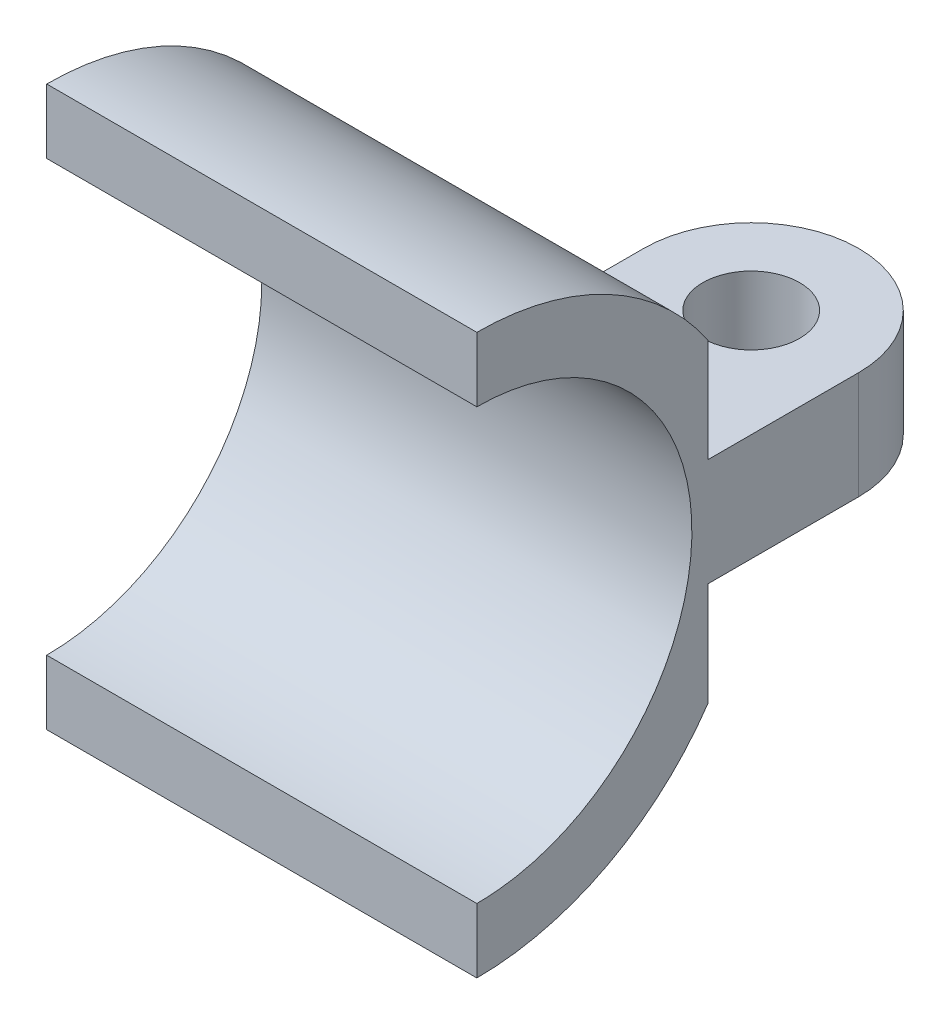
ISO-10303-21;
HEADER;
FILE_DESCRIPTION(('STEP AP214'),'2;1');
FILE_NAME('part.step','',(''),(''),'','','');
FILE_SCHEMA(('AUTOMOTIVE_DESIGN { 1 0 10303 214 1 1 1 1 }'));
ENDSEC;
DATA;
#1=APPLICATION_CONTEXT('core data for automotive mechanical design processes');
#2=APPLICATION_PROTOCOL_DEFINITION('international standard','automotive_design',2000,#1);
#3=PRODUCT_CONTEXT('',#1,'mechanical');
#4=PRODUCT('Part','Part','',(#3));
#5=PRODUCT_RELATED_PRODUCT_CATEGORY('part','',(#4));
#6=PRODUCT_DEFINITION_FORMATION('','',#4);
#7=PRODUCT_DEFINITION_CONTEXT('part definition',#1,'design');
#8=PRODUCT_DEFINITION('design','',#6,#7);
#9=PRODUCT_DEFINITION_SHAPE('','',#8);
#10=(LENGTH_UNIT() NAMED_UNIT(*) SI_UNIT(.MILLI.,.METRE.));
#11=(NAMED_UNIT(*) PLANE_ANGLE_UNIT() SI_UNIT($,.RADIAN.));
#12=(NAMED_UNIT(*) SI_UNIT($,.STERADIAN.) SOLID_ANGLE_UNIT());
#13=UNCERTAINTY_MEASURE_WITH_UNIT(LENGTH_MEASURE(1.E-05),#10,'distance_accuracy_value','');
#14=(GEOMETRIC_REPRESENTATION_CONTEXT(3) GLOBAL_UNCERTAINTY_ASSIGNED_CONTEXT((#13)) GLOBAL_UNIT_ASSIGNED_CONTEXT((#10,
#11,#12)) REPRESENTATION_CONTEXT('',''));
#15=CARTESIAN_POINT('',(0.,0.,0.));
#16=DIRECTION('',(0.,0.,1.));
#17=DIRECTION('',(1.,0.,0.));
#18=AXIS2_PLACEMENT_3D('',#15,#16,#17);
#19=CARTESIAN_POINT('',(230.,0.,-13.));
#20=DIRECTION('',(1.,0.,0.));
#21=DIRECTION('',(0.,1.,0.));
#22=AXIS2_PLACEMENT_3D('',#19,#20,#21);
#23=PLANE('',#22);
#24=DIRECTION('',(0.,-1.,0.));
#25=VECTOR('',#24,1.);
#26=CARTESIAN_POINT('',(230.,-11.5,0.));
#27=LINE('',#26,#25);
#28=CARTESIAN_POINT('',(230.,-10.,0.));
#29=VERTEX_POINT('',#28);
#30=CARTESIAN_POINT('',(230.,-13.,0.));
#31=VERTEX_POINT('',#30);
#32=EDGE_CURVE('E222',#29,#31,#27,.T.);
#33=ORIENTED_EDGE('',*,*,#32,.F.);
#34=CARTESIAN_POINT('',(230.,0.,0.));
#35=DIRECTION('',(-1.,0.,0.));
#36=DIRECTION('',(0.,-1.,0.));
#37=AXIS2_PLACEMENT_3D('',#34,#35,#36);
#38=CIRCLE('',#37,10.);
#39=CARTESIAN_POINT('',(230.,10.,0.));
#40=VERTEX_POINT('',#39);
#41=EDGE_CURVE('E151',#40,#29,#38,.T.);
#42=ORIENTED_EDGE('',*,*,#41,.F.);
#43=DIRECTION('',(0.,-1.,0.));
#44=VECTOR('',#43,1.);
#45=CARTESIAN_POINT('',(230.,11.5,0.));
#46=LINE('',#45,#44);
#47=CARTESIAN_POINT('',(230.,13.,0.));
#48=VERTEX_POINT('',#47);
#49=EDGE_CURVE('E164',#48,#40,#46,.T.);
#50=ORIENTED_EDGE('',*,*,#49,.F.);
#51=CARTESIAN_POINT('',(230.,0.,0.));
#52=DIRECTION('',(1.,0.,0.));
#53=DIRECTION('',(0.,-1.,0.));
#54=AXIS2_PLACEMENT_3D('',#51,#52,#53);
#55=CIRCLE('',#54,13.);
#56=EDGE_CURVE('E11',#31,#48,#55,.T.);
#57=ORIENTED_EDGE('',*,*,#56,.F.);
#58=EDGE_LOOP('',(#33,#42,#50,#57));
#59=FACE_BOUND('',#58,.T.);
#60=ADVANCED_FACE('F17',(#59),#23,.F.);
#61=CARTESIAN_POINT('',(250.,0.,0.));
#62=DIRECTION('',(-1.,0.,0.));
#63=DIRECTION('',(0.,1.,0.));
#64=AXIS2_PLACEMENT_3D('',#61,#62,#63);
#65=CYLINDRICAL_SURFACE('',#64,13.);
#66=ORIENTED_EDGE('',*,*,#56,.T.);
#67=DIRECTION('',(-1.,0.,0.));
#68=VECTOR('',#67,1.);
#69=CARTESIAN_POINT('',(240.,13.,0.));
#70=LINE('',#69,#68);
#71=CARTESIAN_POINT('',(250.,13.,0.));
#72=VERTEX_POINT('',#71);
#73=EDGE_CURVE('E157',#72,#48,#70,.T.);
#74=ORIENTED_EDGE('',*,*,#73,.F.);
#75=CARTESIAN_POINT('',(250.,-5.58828538999E-09,3.94839361206E-09));
#76=DIRECTION('',(1.,0.,0.));
#77=DIRECTION('',(0.,1.,0.));
#78=AXIS2_PLACEMENT_3D('',#75,#76,#77);
#79=CIRCLE('',#78,13.0000000063);
#80=CARTESIAN_POINT('',(250.,7.29927416177,-10.7573508222));
#81=VERTEX_POINT('',#80);
#82=EDGE_CURVE('E138',#81,#72,#79,.T.);
#83=ORIENTED_EDGE('',*,*,#82,.F.);
#84=DIRECTION('',(1.,0.,0.));
#85=VECTOR('',#84,1.);
#86=CARTESIAN_POINT('',(242.5,7.29927416146,-10.7573508222));
#87=LINE('',#86,#85);
#88=CARTESIAN_POINT('',(235.,7.29927416177,-10.7573508222));
#89=VERTEX_POINT('',#88);
#90=EDGE_CURVE('E240',#89,#81,#87,.T.);
#91=ORIENTED_EDGE('',*,*,#90,.F.);
#92=CARTESIAN_POINT('',(235.,1.77339618546E-08,-4.3696017471E-08));
#93=DIRECTION('',(1.,0.,0.));
#94=DIRECTION('',(0.,1.,0.));
#95=AXIS2_PLACEMENT_3D('',#92,#93,#94);
#96=CIRCLE('',#95,12.9999999537);
#97=CARTESIAN_POINT('',(235.,2.5,-12.7573508222));
#98=VERTEX_POINT('',#97);
#99=EDGE_CURVE('E260',#98,#89,#96,.T.);
#100=ORIENTED_EDGE('',*,*,#99,.F.);
#101=DIRECTION('',(-1.,0.,0.));
#102=VECTOR('',#101,1.);
#103=CARTESIAN_POINT('',(237.5,2.5,-12.7573508223));
#104=LINE('',#103,#102);
#105=CARTESIAN_POINT('',(240.,2.5,-12.7573508229));
#106=VERTEX_POINT('',#105);
#107=EDGE_CURVE('E48',#106,#98,#104,.T.);
#108=ORIENTED_EDGE('',*,*,#107,.F.);
#109=CARTESIAN_POINT('',(240.,0.,3.8779148781E-08));
#110=DIRECTION('',(1.,0.,0.));
#111=DIRECTION('',(0.,1.,0.));
#112=AXIS2_PLACEMENT_3D('',#109,#110,#111);
#113=CIRCLE('',#112,13.0000000388);
#114=CARTESIAN_POINT('',(240.,-2.5,-12.7573508229));
#115=VERTEX_POINT('',#114);
#116=EDGE_CURVE('E255',#115,#106,#113,.T.);
#117=ORIENTED_EDGE('',*,*,#116,.F.);
#118=DIRECTION('',(-1.,0.,0.));
#119=VECTOR('',#118,1.);
#120=CARTESIAN_POINT('',(237.5,-2.5,-12.7573508213));
#121=LINE('',#120,#119);
#122=CARTESIAN_POINT('',(235.,-2.5,-12.7573508222));
#123=VERTEX_POINT('',#122);
#124=EDGE_CURVE('E232',#115,#123,#121,.T.);
#125=ORIENTED_EDGE('',*,*,#124,.T.);
#126=CARTESIAN_POINT('',(235.,-1.77339645191E-08,-4.36960245764E-08));
#127=DIRECTION('',(1.,0.,0.));
#128=DIRECTION('',(0.,1.,0.));
#129=AXIS2_PLACEMENT_3D('',#126,#127,#128);
#130=CIRCLE('',#129,12.9999999537);
#131=CARTESIAN_POINT('',(235.,-7.29927416177,-10.7573508222));
#132=VERTEX_POINT('',#131);
#133=EDGE_CURVE('E203',#132,#123,#130,.T.);
#134=ORIENTED_EDGE('',*,*,#133,.F.);
#135=DIRECTION('',(-1.,0.,0.));
#136=VECTOR('',#135,1.);
#137=CARTESIAN_POINT('',(242.5,-7.29927416146,-10.7573508222));
#138=LINE('',#137,#136);
#139=CARTESIAN_POINT('',(250.,-7.29927416177,-10.7573508222));
#140=VERTEX_POINT('',#139);
#141=EDGE_CURVE('E196',#140,#132,#138,.T.);
#142=ORIENTED_EDGE('',*,*,#141,.F.);
#143=CARTESIAN_POINT('',(250.,-9.22362630718E-10,-1.55538870672E-09));
#144=DIRECTION('',(1.,0.,0.));
#145=DIRECTION('',(0.,1.,0.));
#146=AXIS2_PLACEMENT_3D('',#143,#144,#145);
#147=CIRCLE('',#146,12.9999999983);
#148=CARTESIAN_POINT('',(250.,-13.,0.));
#149=VERTEX_POINT('',#148);
#150=EDGE_CURVE('E183',#149,#140,#147,.T.);
#151=ORIENTED_EDGE('',*,*,#150,.F.);
#152=DIRECTION('',(-1.,0.,0.));
#153=VECTOR('',#152,1.);
#154=CARTESIAN_POINT('',(240.,-13.,0.));
#155=LINE('',#154,#153);
#156=EDGE_CURVE('E28',#149,#31,#155,.T.);
#157=ORIENTED_EDGE('',*,*,#156,.T.);
#158=EDGE_LOOP('',(#66,#74,#83,#91,#100,#108,#117,#125,#134,#142,#151,#157));
#159=FACE_BOUND('',#158,.T.);
#160=ADVANCED_FACE('F162',(#159),#65,.T.);
#161=CARTESIAN_POINT('',(240.,11.5,0.));
#162=DIRECTION('',(0.,0.,-1.));
#163=DIRECTION('',(0.,-1.,0.));
#164=AXIS2_PLACEMENT_3D('',#161,#162,#163);
#165=PLANE('',#164);
#166=DIRECTION('',(-1.,0.,0.));
#167=VECTOR('',#166,1.);
#168=CARTESIAN_POINT('',(250.,-10.,0.));
#169=LINE('',#168,#167);
#170=CARTESIAN_POINT('',(250.,-10.,0.));
#171=VERTEX_POINT('',#170);
#172=EDGE_CURVE('E192',#171,#29,#169,.T.);
#173=ORIENTED_EDGE('',*,*,#172,.T.);
#174=ORIENTED_EDGE('',*,*,#32,.T.);
#175=ORIENTED_EDGE('',*,*,#156,.F.);
#176=DIRECTION('',(0.,-1.,0.));
#177=VECTOR('',#176,1.);
#178=CARTESIAN_POINT('',(250.,-11.4999999993,-7.4505734915E-10));
#179=LINE('',#178,#177);
#180=EDGE_CURVE('E179',#171,#149,#179,.T.);
#181=ORIENTED_EDGE('',*,*,#180,.F.);
#182=EDGE_LOOP('',(#173,#174,#175,#181));
#183=FACE_BOUND('',#182,.T.);
#184=ADVANCED_FACE('F279',(#183),#165,.F.);
#185=CARTESIAN_POINT('',(245.,-2.5,-28.5138940665));
#186=DIRECTION('',(0.,1.,0.));
#187=DIRECTION('',(1.,0.,0.));
#188=AXIS2_PLACEMENT_3D('',#185,#186,#187);
#189=PLANE('',#188);
#190=CARTESIAN_POINT('',(245.,-2.5,-17.7573508222));
#191=DIRECTION('',(0.,1.,0.));
#192=DIRECTION('',(1.,0.,0.));
#193=AXIS2_PLACEMENT_3D('',#190,#191,#192);
#194=CIRCLE('',#193,2.25);
#195=CARTESIAN_POINT('',(247.25,-2.5,-17.7573508222));
#196=VERTEX_POINT('',#195);
#197=EDGE_CURVE('E266',#196,#196,#194,.T.);
#198=ORIENTED_EDGE('',*,*,#197,.T.);
#199=EDGE_LOOP('',(#198));
#200=FACE_BOUND('',#199,.T.);
#201=DIRECTION('',(0.,0.,-1.));
#202=VECTOR('',#201,1.);
#203=CARTESIAN_POINT('',(240.,-2.5,-15.2573508229));
#204=LINE('',#203,#202);
#205=CARTESIAN_POINT('',(240.,-2.5,-17.7573508229));
#206=VERTEX_POINT('',#205);
#207=EDGE_CURVE('E202',#115,#206,#204,.T.);
#208=ORIENTED_EDGE('',*,*,#207,.T.);
#209=CARTESIAN_POINT('',(245.,-2.5,-17.7573508222));
#210=DIRECTION('',(0.,-1.,0.));
#211=DIRECTION('',(1.,0.,0.));
#212=AXIS2_PLACEMENT_3D('',#209,#210,#211);
#213=CIRCLE('',#212,5.);
#214=CARTESIAN_POINT('',(250.,-2.5,-17.7573508222));
#215=VERTEX_POINT('',#214);
#216=EDGE_CURVE('E229',#206,#215,#213,.T.);
#217=ORIENTED_EDGE('',*,*,#216,.T.);
#218=DIRECTION('',(0.,0.,-1.));
#219=VECTOR('',#218,1.);
#220=CARTESIAN_POINT('',(250.,-2.49999999925,-14.2573508218));
#221=LINE('',#220,#219);
#222=CARTESIAN_POINT('',(250.,-2.49999999925,-10.7573508218));
#223=VERTEX_POINT('',#222);
#224=EDGE_CURVE('E191',#223,#215,#221,.T.);
#225=ORIENTED_EDGE('',*,*,#224,.F.);
#226=DIRECTION('',(-1.,0.,0.));
#227=VECTOR('',#226,1.);
#228=CARTESIAN_POINT('',(242.5,-2.5,-10.7573508222));
#229=LINE('',#228,#227);
#230=CARTESIAN_POINT('',(235.,-2.5,-10.7573508222));
#231=VERTEX_POINT('',#230);
#232=EDGE_CURVE('E215',#223,#231,#229,.T.);
#233=ORIENTED_EDGE('',*,*,#232,.T.);
#234=DIRECTION('',(0.,0.,1.));
#235=VECTOR('',#234,1.);
#236=CARTESIAN_POINT('',(235.,-2.5,-11.7573508222));
#237=LINE('',#236,#235);
#238=EDGE_CURVE('E247',#123,#231,#237,.T.);
#239=ORIENTED_EDGE('',*,*,#238,.F.);
#240=ORIENTED_EDGE('',*,*,#124,.F.);
#241=EDGE_LOOP('',(#208,#217,#225,#233,#239,#240));
#242=FACE_BOUND('',#241,.T.);
#243=ADVANCED_FACE('F407',(#200,#242),#189,.F.);
#244=CARTESIAN_POINT('',(249.296627045,2.5,-26.4592580287));
#245=DIRECTION('',(0.,-1.,0.));
#246=DIRECTION('',(0.,0.,-1.));
#247=AXIS2_PLACEMENT_3D('',#244,#245,#246);
#248=PLANE('',#247);
#249=CARTESIAN_POINT('',(245.,2.5,-17.7573508222));
#250=DIRECTION('',(0.,1.,0.));
#251=DIRECTION('',(1.,0.,0.));
#252=AXIS2_PLACEMENT_3D('',#249,#250,#251);
#253=CIRCLE('',#252,2.25);
#254=CARTESIAN_POINT('',(247.25,2.5,-17.7573508222));
#255=VERTEX_POINT('',#254);
#256=EDGE_CURVE('E233',#255,#255,#253,.T.);
#257=ORIENTED_EDGE('',*,*,#256,.F.);
#258=EDGE_LOOP('',(#257));
#259=FACE_BOUND('',#258,.T.);
#260=DIRECTION('',(0.,0.,1.));
#261=VECTOR('',#260,1.);
#262=CARTESIAN_POINT('',(250.,2.50000000075,-14.2573508218));
#263=LINE('',#262,#261);
#264=CARTESIAN_POINT('',(250.,2.5,-17.7573508222));
#265=VERTEX_POINT('',#264);
#266=CARTESIAN_POINT('',(250.,2.50000000075,-10.7573508218));
#267=VERTEX_POINT('',#266);
#268=EDGE_CURVE('E178',#265,#267,#263,.T.);
#269=ORIENTED_EDGE('',*,*,#268,.F.);
#270=CARTESIAN_POINT('',(245.,2.5,-17.7573508222));
#271=DIRECTION('',(0.,-1.,0.));
#272=DIRECTION('',(1.,0.,0.));
#273=AXIS2_PLACEMENT_3D('',#270,#271,#272);
#274=CIRCLE('',#273,5.);
#275=CARTESIAN_POINT('',(240.,2.5,-17.7573508229));
#276=VERTEX_POINT('',#275);
#277=EDGE_CURVE('E226',#276,#265,#274,.T.);
#278=ORIENTED_EDGE('',*,*,#277,.F.);
#279=DIRECTION('',(0.,0.,1.));
#280=VECTOR('',#279,1.);
#281=CARTESIAN_POINT('',(240.,2.5,-15.2573508229));
#282=LINE('',#281,#280);
#283=EDGE_CURVE('E200',#276,#106,#282,.T.);
#284=ORIENTED_EDGE('',*,*,#283,.T.);
#285=ORIENTED_EDGE('',*,*,#107,.T.);
#286=DIRECTION('',(0.,0.,-1.));
#287=VECTOR('',#286,1.);
#288=CARTESIAN_POINT('',(235.,2.5,-11.7573508222));
#289=LINE('',#288,#287);
#290=CARTESIAN_POINT('',(235.,2.5,-10.7573508223));
#291=VERTEX_POINT('',#290);
#292=EDGE_CURVE('E256',#291,#98,#289,.T.);
#293=ORIENTED_EDGE('',*,*,#292,.F.);
#294=DIRECTION('',(-1.,0.,0.));
#295=VECTOR('',#294,1.);
#296=CARTESIAN_POINT('',(242.5,2.5,-10.7573508222));
#297=LINE('',#296,#295);
#298=EDGE_CURVE('E243',#267,#291,#297,.T.);
#299=ORIENTED_EDGE('',*,*,#298,.F.);
#300=EDGE_LOOP('',(#269,#278,#284,#285,#293,#299));
#301=FACE_BOUND('',#300,.T.);
#302=ADVANCED_FACE('F331',(#259,#301),#248,.F.);
#303=CARTESIAN_POINT('',(245.,2.5,-17.7573508222));
#304=DIRECTION('',(0.,-1.,0.));
#305=DIRECTION('',(-1.,0.,0.));
#306=AXIS2_PLACEMENT_3D('',#303,#304,#305);
#307=CYLINDRICAL_SURFACE('',#306,2.25);
#308=ORIENTED_EDGE('',*,*,#197,.F.);
#309=EDGE_LOOP('',(#308));
#310=FACE_BOUND('',#309,.T.);
#311=ORIENTED_EDGE('',*,*,#256,.T.);
#312=EDGE_LOOP('',(#311));
#313=FACE_BOUND('',#312,.T.);
#314=ADVANCED_FACE('F325',(#310,#313),#307,.F.);
#315=CARTESIAN_POINT('',(235.,-5.5,-9.75735082217));
#316=DIRECTION('',(1.,0.,0.));
#317=DIRECTION('',(0.,1.,0.));
#318=AXIS2_PLACEMENT_3D('',#315,#316,#317);
#319=PLANE('',#318);
#320=ORIENTED_EDGE('',*,*,#292,.T.);
#321=ORIENTED_EDGE('',*,*,#99,.T.);
#322=DIRECTION('',(0.,-1.,0.));
#323=VECTOR('',#322,1.);
#324=CARTESIAN_POINT('',(235.,4.89963708073,-10.7573508222));
#325=LINE('',#324,#323);
#326=EDGE_CURVE('E236',#89,#291,#325,.T.);
#327=ORIENTED_EDGE('',*,*,#326,.T.);
#328=EDGE_LOOP('',(#320,#321,#327));
#329=FACE_BOUND('',#328,.T.);
#330=ADVANCED_FACE('F330',(#329),#319,.T.);
#331=CARTESIAN_POINT('',(240.,14.5,-27.));
#332=DIRECTION('',(1.,0.,0.));
#333=DIRECTION('',(0.,1.,0.));
#334=AXIS2_PLACEMENT_3D('',#331,#332,#333);
#335=PLANE('',#334);
#336=ORIENTED_EDGE('',*,*,#283,.F.);
#337=DIRECTION('',(0.,-1.,0.));
#338=VECTOR('',#337,1.);
#339=CARTESIAN_POINT('',(240.,2.5,-17.7573508222));
#340=LINE('',#339,#338);
#341=EDGE_CURVE('E219',#276,#206,#340,.T.);
#342=ORIENTED_EDGE('',*,*,#341,.T.);
#343=ORIENTED_EDGE('',*,*,#207,.F.);
#344=ORIENTED_EDGE('',*,*,#116,.T.);
#345=EDGE_LOOP('',(#336,#342,#343,#344));
#346=FACE_BOUND('',#345,.T.);
#347=ADVANCED_FACE('F415',(#346),#335,.F.);
#348=CARTESIAN_POINT('',(235.,-5.5,-9.75735082217));
#349=DIRECTION('',(1.,0.,0.));
#350=DIRECTION('',(0.,1.,0.));
#351=AXIS2_PLACEMENT_3D('',#348,#349,#350);
#352=PLANE('',#351);
#353=ORIENTED_EDGE('',*,*,#238,.T.);
#354=DIRECTION('',(0.,-1.,0.));
#355=VECTOR('',#354,1.);
#356=CARTESIAN_POINT('',(235.,-4.89963708073,-10.7573508222));
#357=LINE('',#356,#355);
#358=EDGE_CURVE('E211',#231,#132,#357,.T.);
#359=ORIENTED_EDGE('',*,*,#358,.T.);
#360=ORIENTED_EDGE('',*,*,#133,.T.);
#361=EDGE_LOOP('',(#353,#359,#360));
#362=FACE_BOUND('',#361,.T.);
#363=ADVANCED_FACE('F430',(#362),#352,.T.);
#364=CARTESIAN_POINT('',(242.5,-5.5,-10.7573508222));
#365=DIRECTION('',(0.,0.,-1.));
#366=DIRECTION('',(0.,-1.,0.));
#367=AXIS2_PLACEMENT_3D('',#364,#365,#366);
#368=PLANE('',#367);
#369=ORIENTED_EDGE('',*,*,#326,.F.);
#370=ORIENTED_EDGE('',*,*,#90,.T.);
#371=DIRECTION('',(0.,-1.,0.));
#372=VECTOR('',#371,1.);
#373=CARTESIAN_POINT('',(250.,4.89963708147,-10.7573508218));
#374=LINE('',#373,#372);
#375=EDGE_CURVE('E146',#81,#267,#374,.T.);
#376=ORIENTED_EDGE('',*,*,#375,.T.);
#377=ORIENTED_EDGE('',*,*,#298,.T.);
#378=EDGE_LOOP('',(#369,#370,#376,#377));
#379=FACE_BOUND('',#378,.T.);
#380=ADVANCED_FACE('F444',(#379),#368,.T.);
#381=CARTESIAN_POINT('',(245.,2.5,-17.7573508222));
#382=DIRECTION('',(0.,-1.,0.));
#383=DIRECTION('',(-1.,0.,0.));
#384=AXIS2_PLACEMENT_3D('',#381,#382,#383);
#385=CYLINDRICAL_SURFACE('',#384,5.);
#386=ORIENTED_EDGE('',*,*,#341,.F.);
#387=ORIENTED_EDGE('',*,*,#277,.T.);
#388=DIRECTION('',(0.,-1.,0.));
#389=VECTOR('',#388,1.);
#390=CARTESIAN_POINT('',(250.,7.4505734915E-10,-17.7573508218));
#391=LINE('',#390,#389);
#392=EDGE_CURVE('E171',#265,#215,#391,.T.);
#393=ORIENTED_EDGE('',*,*,#392,.T.);
#394=ORIENTED_EDGE('',*,*,#216,.F.);
#395=EDGE_LOOP('',(#386,#387,#393,#394));
#396=FACE_BOUND('',#395,.T.);
#397=ADVANCED_FACE('F448',(#396),#385,.T.);
#398=CARTESIAN_POINT('',(242.5,-5.5,-10.7573508222));
#399=DIRECTION('',(0.,0.,-1.));
#400=DIRECTION('',(0.,-1.,0.));
#401=AXIS2_PLACEMENT_3D('',#398,#399,#400);
#402=PLANE('',#401);
#403=DIRECTION('',(0.,-1.,0.));
#404=VECTOR('',#403,1.);
#405=CARTESIAN_POINT('',(250.,-4.89963708092,-10.7573508218));
#406=LINE('',#405,#404);
#407=EDGE_CURVE('E187',#223,#140,#406,.T.);
#408=ORIENTED_EDGE('',*,*,#407,.T.);
#409=ORIENTED_EDGE('',*,*,#141,.T.);
#410=ORIENTED_EDGE('',*,*,#358,.F.);
#411=ORIENTED_EDGE('',*,*,#232,.F.);
#412=EDGE_LOOP('',(#408,#409,#410,#411));
#413=FACE_BOUND('',#412,.T.);
#414=ADVANCED_FACE('F457',(#413),#402,.T.);
#415=CARTESIAN_POINT('',(250.,0.,0.));
#416=DIRECTION('',(-1.,0.,0.));
#417=DIRECTION('',(0.,1.,0.));
#418=AXIS2_PLACEMENT_3D('',#415,#416,#417);
#419=CYLINDRICAL_SURFACE('',#418,10.);
#420=DIRECTION('',(-1.,0.,0.));
#421=VECTOR('',#420,1.);
#422=CARTESIAN_POINT('',(240.,10.,0.));
#423=LINE('',#422,#421);
#424=CARTESIAN_POINT('',(250.,10.,0.));
#425=VERTEX_POINT('',#424);
#426=EDGE_CURVE('E159',#425,#40,#423,.T.);
#427=ORIENTED_EDGE('',*,*,#426,.T.);
#428=ORIENTED_EDGE('',*,*,#41,.T.);
#429=ORIENTED_EDGE('',*,*,#172,.F.);
#430=CARTESIAN_POINT('',(250.,10.0000000007,-7.4505734915E-10));
#431=CARTESIAN_POINT('',(250.,10.0000000007,-0.929507948383));
#432=CARTESIAN_POINT('',(250.,9.89200187266,-1.85901551419));
#433=CARTESIAN_POINT('',(250.,9.67598094947,-2.77182886148));
#434=CARTESIAN_POINT('',(250.,9.03584317265,-4.53047065329));
#435=CARTESIAN_POINT('',(250.,8.00953498869,-6.09548923409));
#436=CARTESIAN_POINT('',(250.,7.4072985333,-6.8146585387));
#437=CARTESIAN_POINT('',(250.,6.04682547522,-8.09984739646));
#438=CARTESIAN_POINT('',(250.,4.42792626062,-9.03886656377));
#439=CARTESIAN_POINT('',(250.,3.56723265729,-9.41182733215));
#440=CARTESIAN_POINT('',(250.,1.77503491596,-9.95092343551));
#441=CARTESIAN_POINT('',(250.,-0.0930222342879,-10.0647397673));
#442=CARTESIAN_POINT('',(250.,-1.02958555411,-10.0123721544));
#443=CARTESIAN_POINT('',(250.,-2.87331135038,-9.69101171535));
#444=CARTESIAN_POINT('',(250.,-4.59423700117,-8.95548022777));
#445=CARTESIAN_POINT('',(250.,-5.40798760363,-8.48889348744));
#446=CARTESIAN_POINT('',(250.,-6.9121136782,-7.37524987218));
#447=CARTESIAN_POINT('',(250.,-8.1208308614,-5.9464061289));
#448=CARTESIAN_POINT('',(250.,-8.63913977373,-5.16458193133));
#449=CARTESIAN_POINT('',(250.,-9.38297394315,-3.6955691381));
#450=CARTESIAN_POINT('',(250.,-9.81303538441,-2.11093779069));
#451=CARTESIAN_POINT('',(250.,-9.93768010936,-1.41217460004));
#452=CARTESIAN_POINT('',(250.,-9.99999999925,-0.706087190225));
#453=CARTESIAN_POINT('',(250.,-9.99999999925,-7.4505734915E-10));
#454=B_SPLINE_CURVE_WITH_KNOTS('',5,(#430,#431,#432,#433,#434,#435,#436,#437,#438,#439,#440,
#441,#442,#443,#444,#445,#446,#447,#448,#449,#450,#451,#452,#453),.UNSPECIFIED.,.F.,.F.,(6,3,3,
3,3,3,3,6),(0.,6.57261372942,13.145227467,19.7178412275,26.2904549846,32.8630687282,
39.4356824976,44.4284728955),.UNSPECIFIED.);
#455=EDGE_CURVE('E20',#425,#171,#454,.T.);
#456=ORIENTED_EDGE('',*,*,#455,.F.);
#457=EDGE_LOOP('',(#427,#428,#429,#456));
#458=FACE_BOUND('',#457,.T.);
#459=ADVANCED_FACE('F283',(#458),#419,.F.);
#460=CARTESIAN_POINT('',(250.,9.45,-15.7));
#461=DIRECTION('',(1.,0.,0.));
#462=DIRECTION('',(0.,1.,0.));
#463=AXIS2_PLACEMENT_3D('',#460,#461,#462);
#464=PLANE('',#463);
#465=DIRECTION('',(0.,-1.,0.));
#466=VECTOR('',#465,1.);
#467=CARTESIAN_POINT('',(250.,11.5,0.));
#468=LINE('',#467,#466);
#469=EDGE_CURVE('E142',#72,#425,#468,.T.);
#470=ORIENTED_EDGE('',*,*,#469,.T.);
#471=ORIENTED_EDGE('',*,*,#455,.T.);
#472=ORIENTED_EDGE('',*,*,#180,.T.);
#473=ORIENTED_EDGE('',*,*,#150,.T.);
#474=ORIENTED_EDGE('',*,*,#407,.F.);
#475=ORIENTED_EDGE('',*,*,#224,.T.);
#476=ORIENTED_EDGE('',*,*,#392,.F.);
#477=ORIENTED_EDGE('',*,*,#268,.T.);
#478=ORIENTED_EDGE('',*,*,#375,.F.);
#479=ORIENTED_EDGE('',*,*,#82,.T.);
#480=EDGE_LOOP('',(#470,#471,#472,#473,#474,#475,#476,#477,#478,#479));
#481=FACE_BOUND('',#480,.T.);
#482=ADVANCED_FACE('F140',(#481),#464,.T.);
#483=CARTESIAN_POINT('',(240.,11.5,0.));
#484=DIRECTION('',(0.,0.,-1.));
#485=DIRECTION('',(0.,-1.,0.));
#486=AXIS2_PLACEMENT_3D('',#483,#484,#485);
#487=PLANE('',#486);
#488=ORIENTED_EDGE('',*,*,#73,.T.);
#489=ORIENTED_EDGE('',*,*,#49,.T.);
#490=ORIENTED_EDGE('',*,*,#426,.F.);
#491=ORIENTED_EDGE('',*,*,#469,.F.);
#492=EDGE_LOOP('',(#488,#489,#490,#491));
#493=FACE_BOUND('',#492,.T.);
#494=ADVANCED_FACE('F155',(#493),#487,.F.);
#495=CLOSED_SHELL('',(#60,#160,#184,#243,#302,#314,#330,#347,#363,#380,#397,#414,#459,#482,#494));
#496=MANIFOLD_SOLID_BREP('B1',#495);
#497=ADVANCED_BREP_SHAPE_REPRESENTATION('',(#18,#496),#14);
#498=SHAPE_DEFINITION_REPRESENTATION(#9,#497);
ENDSEC;
END-ISO-10303-21;
